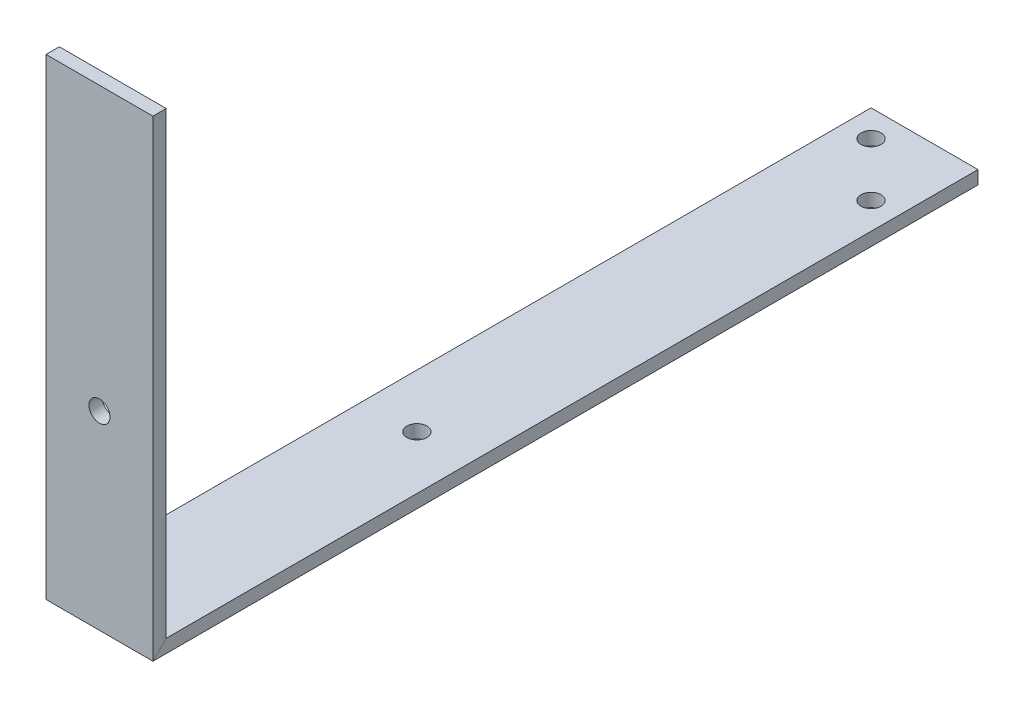
ISO-10303-21;
HEADER;
FILE_DESCRIPTION(('STEP AP214'),'2;1');
FILE_NAME('part.step','',(''),(''),'','','');
FILE_SCHEMA(('AUTOMOTIVE_DESIGN { 1 0 10303 214 1 1 1 1 }'));
ENDSEC;
DATA;
#1=APPLICATION_CONTEXT('core data for automotive mechanical design processes');
#2=APPLICATION_PROTOCOL_DEFINITION('international standard','automotive_design',2000,#1);
#3=PRODUCT_CONTEXT('',#1,'mechanical');
#4=PRODUCT('Part','Part','',(#3));
#5=PRODUCT_RELATED_PRODUCT_CATEGORY('part','',(#4));
#6=PRODUCT_DEFINITION_FORMATION('','',#4);
#7=PRODUCT_DEFINITION_CONTEXT('part definition',#1,'design');
#8=PRODUCT_DEFINITION('design','',#6,#7);
#9=PRODUCT_DEFINITION_SHAPE('','',#8);
#10=(LENGTH_UNIT() NAMED_UNIT(*) SI_UNIT(.MILLI.,.METRE.));
#11=(NAMED_UNIT(*) PLANE_ANGLE_UNIT() SI_UNIT($,.RADIAN.));
#12=(NAMED_UNIT(*) SI_UNIT($,.STERADIAN.) SOLID_ANGLE_UNIT());
#13=UNCERTAINTY_MEASURE_WITH_UNIT(LENGTH_MEASURE(1.E-05),#10,'distance_accuracy_value','');
#14=(GEOMETRIC_REPRESENTATION_CONTEXT(3) GLOBAL_UNCERTAINTY_ASSIGNED_CONTEXT((#13)) GLOBAL_UNIT_ASSIGNED_CONTEXT((#10,
#11,#12)) REPRESENTATION_CONTEXT('',''));
#15=CARTESIAN_POINT('',(0.,0.,0.));
#16=DIRECTION('',(0.,0.,1.));
#17=DIRECTION('',(1.,0.,0.));
#18=AXIS2_PLACEMENT_3D('',#15,#16,#17);
#19=CARTESIAN_POINT('',(1761.3,-570.8105,696.315));
#20=DIRECTION('',(0.,0.,-1.));
#21=DIRECTION('',(-1.,0.,0.));
#22=AXIS2_PLACEMENT_3D('',#19,#20,#21);
#23=PLANE('',#22);
#24=CARTESIAN_POINT('',(1786.7,-480.185,696.315));
#25=DIRECTION('',(0.,0.,-1.));
#26=DIRECTION('',(-1.,0.,0.));
#27=AXIS2_PLACEMENT_3D('',#24,#25,#26);
#28=CIRCLE('',#27,4.99999999999982);
#29=CARTESIAN_POINT('',(1781.7,-480.185,696.315));
#30=VERTEX_POINT('',#29);
#31=EDGE_CURVE('E130',#30,#30,#28,.T.);
#32=ORIENTED_EDGE('',*,*,#31,.T.);
#33=EDGE_LOOP('',(#32));
#34=FACE_BOUND('',#33,.T.);
#35=DIRECTION('',(0.,1.,0.));
#36=VECTOR('',#35,1.);
#37=CARTESIAN_POINT('',(1812.1,-570.8105,696.315));
#38=LINE('',#37,#36);
#39=CARTESIAN_POINT('',(1812.1,-570.395,696.315));
#40=VERTEX_POINT('',#39);
#41=CARTESIAN_POINT('',(1812.1,-346.185,696.315));
#42=VERTEX_POINT('',#41);
#43=EDGE_CURVE('E92',#40,#42,#38,.T.);
#44=ORIENTED_EDGE('',*,*,#43,.T.);
#45=DIRECTION('',(1.,0.,0.));
#46=VECTOR('',#45,1.);
#47=CARTESIAN_POINT('',(1812.1,-346.185,696.315));
#48=LINE('',#47,#46);
#49=CARTESIAN_POINT('',(1761.3,-346.185,696.315));
#50=VERTEX_POINT('',#49);
#51=EDGE_CURVE('E96',#50,#42,#48,.T.);
#52=ORIENTED_EDGE('',*,*,#51,.F.);
#53=DIRECTION('',(0.,1.,0.));
#54=VECTOR('',#53,1.);
#55=CARTESIAN_POINT('',(1761.3,-570.8105,696.315));
#56=LINE('',#55,#54);
#57=CARTESIAN_POINT('',(1761.3,-570.395,696.315));
#58=VERTEX_POINT('',#57);
#59=EDGE_CURVE('E151',#58,#50,#56,.T.);
#60=ORIENTED_EDGE('',*,*,#59,.F.);
#61=DIRECTION('',(1.,0.,0.));
#62=VECTOR('',#61,1.);
#63=CARTESIAN_POINT('',(1761.3,-570.395,696.315));
#64=LINE('',#63,#62);
#65=EDGE_CURVE('E98',#58,#40,#64,.T.);
#66=ORIENTED_EDGE('',*,*,#65,.T.);
#67=EDGE_LOOP('',(#44,#52,#60,#66));
#68=FACE_BOUND('',#67,.T.);
#69=ADVANCED_FACE('F35',(#34,#68),#23,.F.);
#70=CARTESIAN_POINT('',(1812.1,-570.8105,696.315));
#71=DIRECTION('',(-1.,0.,0.));
#72=DIRECTION('',(0.,0.,1.));
#73=AXIS2_PLACEMENT_3D('',#70,#71,#72);
#74=PLANE('',#73);
#75=DIRECTION('',(0.,1.,0.));
#76=VECTOR('',#75,1.);
#77=CARTESIAN_POINT('',(1812.1,-570.8105,690.005));
#78=LINE('',#77,#76);
#79=CARTESIAN_POINT('',(1812.1,-564.085,690.005));
#80=VERTEX_POINT('',#79);
#81=CARTESIAN_POINT('',(1812.1,-346.185,690.005));
#82=VERTEX_POINT('',#81);
#83=EDGE_CURVE('E101',#80,#82,#78,.T.);
#84=ORIENTED_EDGE('',*,*,#83,.T.);
#85=DIRECTION('',(0.,0.,-1.));
#86=VECTOR('',#85,1.);
#87=CARTESIAN_POINT('',(1812.1,-346.185,690.005));
#88=LINE('',#87,#86);
#89=EDGE_CURVE('E104',#42,#82,#88,.T.);
#90=ORIENTED_EDGE('',*,*,#89,.F.);
#91=ORIENTED_EDGE('',*,*,#43,.F.);
#92=DIRECTION('',(0.,0.707106781186548,-0.707106781186548));
#93=VECTOR('',#92,1.);
#94=CARTESIAN_POINT('',(1812.1,-376.3175,502.2375));
#95=LINE('',#94,#93);
#96=EDGE_CURVE('E43',#40,#80,#95,.T.);
#97=ORIENTED_EDGE('',*,*,#96,.T.);
#98=EDGE_LOOP('',(#84,#90,#91,#97));
#99=FACE_BOUND('',#98,.T.);
#100=ADVANCED_FACE('F105',(#99),#74,.F.);
#101=CARTESIAN_POINT('',(1761.3,-570.8105,690.005));
#102=DIRECTION('',(0.,0.,1.));
#103=DIRECTION('',(1.,0.,0.));
#104=AXIS2_PLACEMENT_3D('',#101,#102,#103);
#105=PLANE('',#104);
#106=CARTESIAN_POINT('',(1786.7,-480.185,690.005));
#107=DIRECTION('',(0.,0.,-1.));
#108=DIRECTION('',(-1.,0.,0.));
#109=AXIS2_PLACEMENT_3D('',#106,#107,#108);
#110=CIRCLE('',#109,4.99999999999982);
#111=CARTESIAN_POINT('',(1781.7,-480.185,690.005));
#112=VERTEX_POINT('',#111);
#113=EDGE_CURVE('E127',#112,#112,#110,.T.);
#114=ORIENTED_EDGE('',*,*,#113,.F.);
#115=EDGE_LOOP('',(#114));
#116=FACE_BOUND('',#115,.T.);
#117=DIRECTION('',(0.,1.,0.));
#118=VECTOR('',#117,1.);
#119=CARTESIAN_POINT('',(1761.3,-570.8105,690.005));
#120=LINE('',#119,#118);
#121=CARTESIAN_POINT('',(1761.3,-564.085,690.005));
#122=VERTEX_POINT('',#121);
#123=CARTESIAN_POINT('',(1761.3,-346.185,690.005));
#124=VERTEX_POINT('',#123);
#125=EDGE_CURVE('E160',#122,#124,#120,.T.);
#126=ORIENTED_EDGE('',*,*,#125,.T.);
#127=DIRECTION('',(-1.,0.,0.));
#128=VECTOR('',#127,1.);
#129=CARTESIAN_POINT('',(1761.3,-346.185,690.005));
#130=LINE('',#129,#128);
#131=EDGE_CURVE('E110',#82,#124,#130,.T.);
#132=ORIENTED_EDGE('',*,*,#131,.F.);
#133=ORIENTED_EDGE('',*,*,#83,.F.);
#134=DIRECTION('',(-1.,0.,0.));
#135=VECTOR('',#134,1.);
#136=CARTESIAN_POINT('',(1761.3,-564.085,690.005));
#137=LINE('',#136,#135);
#138=EDGE_CURVE('E11',#80,#122,#137,.T.);
#139=ORIENTED_EDGE('',*,*,#138,.T.);
#140=EDGE_LOOP('',(#126,#132,#133,#139));
#141=FACE_BOUND('',#140,.T.);
#142=ADVANCED_FACE('F188',(#116,#141),#105,.F.);
#143=CARTESIAN_POINT('',(1761.3,-570.8105,696.315));
#144=DIRECTION('',(1.,0.,0.));
#145=DIRECTION('',(0.,0.,-1.));
#146=AXIS2_PLACEMENT_3D('',#143,#144,#145);
#147=PLANE('',#146);
#148=ORIENTED_EDGE('',*,*,#59,.T.);
#149=DIRECTION('',(0.,0.,1.));
#150=VECTOR('',#149,1.);
#151=CARTESIAN_POINT('',(1761.3,-346.185,696.315));
#152=LINE('',#151,#150);
#153=EDGE_CURVE('E115',#124,#50,#152,.T.);
#154=ORIENTED_EDGE('',*,*,#153,.F.);
#155=ORIENTED_EDGE('',*,*,#125,.F.);
#156=DIRECTION('',(0.,-0.707106781186548,0.707106781186548));
#157=VECTOR('',#156,1.);
#158=CARTESIAN_POINT('',(1761.3,-376.3175,502.2375));
#159=LINE('',#158,#157);
#160=EDGE_CURVE('E148',#122,#58,#159,.T.);
#161=ORIENTED_EDGE('',*,*,#160,.T.);
#162=EDGE_LOOP('',(#148,#154,#155,#161));
#163=FACE_BOUND('',#162,.T.);
#164=ADVANCED_FACE('F194',(#163),#147,.F.);
#165=CARTESIAN_POINT('',(1761.3,-570.395,308.16));
#166=DIRECTION('',(0.,1.,0.));
#167=DIRECTION('',(0.,0.,1.));
#168=AXIS2_PLACEMENT_3D('',#165,#166,#167);
#169=PLANE('',#168);
#170=CARTESIAN_POINT('',(1773.99999999906,-570.395,317.152204665887));
#171=DIRECTION('',(0.,-1.,0.));
#172=DIRECTION('',(0.,0.,-1.));
#173=AXIS2_PLACEMENT_3D('',#170,#171,#172);
#174=CIRCLE('',#173,4.7624999999999);
#175=CARTESIAN_POINT('',(1773.99999999906,-570.395,312.389704665887));
#176=VERTEX_POINT('',#175);
#177=EDGE_CURVE('E120',#176,#176,#174,.T.);
#178=ORIENTED_EDGE('',*,*,#177,.F.);
#179=EDGE_LOOP('',(#178));
#180=FACE_BOUND('',#179,.T.);
#181=CARTESIAN_POINT('',(1799.39999999906,-570.395,342.552204665886));
#182=DIRECTION('',(0.,-1.,0.));
#183=DIRECTION('',(0.,0.,-1.));
#184=AXIS2_PLACEMENT_3D('',#181,#182,#183);
#185=CIRCLE('',#184,4.76250000000011);
#186=CARTESIAN_POINT('',(1799.39999999906,-570.395,337.789704665886));
#187=VERTEX_POINT('',#186);
#188=EDGE_CURVE('E123',#187,#187,#185,.T.);
#189=ORIENTED_EDGE('',*,*,#188,.F.);
#190=EDGE_LOOP('',(#189));
#191=FACE_BOUND('',#190,.T.);
#192=CARTESIAN_POINT('',(1786.69999999999,-570.395,545.545000000005));
#193=DIRECTION('',(0.,1.,0.));
#194=DIRECTION('',(0.,0.,1.));
#195=AXIS2_PLACEMENT_3D('',#192,#193,#194);
#196=CIRCLE('',#195,4.76249999999989);
#197=CARTESIAN_POINT('',(1786.69999999999,-570.395,550.307500000005));
#198=VERTEX_POINT('',#197);
#199=EDGE_CURVE('E136',#198,#198,#196,.T.);
#200=ORIENTED_EDGE('',*,*,#199,.T.);
#201=EDGE_LOOP('',(#200));
#202=FACE_BOUND('',#201,.T.);
#203=DIRECTION('',(0.,0.,1.));
#204=VECTOR('',#203,1.);
#205=CARTESIAN_POINT('',(1761.3,-570.395,308.16));
#206=LINE('',#205,#204);
#207=CARTESIAN_POINT('',(1761.3,-570.395,304.45));
#208=VERTEX_POINT('',#207);
#209=EDGE_CURVE('E155',#208,#58,#206,.T.);
#210=ORIENTED_EDGE('',*,*,#209,.F.);
#211=DIRECTION('',(1.,0.,0.));
#212=VECTOR('',#211,1.);
#213=CARTESIAN_POINT('',(1761.3,-570.395,304.45));
#214=LINE('',#213,#212);
#215=CARTESIAN_POINT('',(1812.1,-570.395,304.45));
#216=VERTEX_POINT('',#215);
#217=EDGE_CURVE('E51',#208,#216,#214,.T.);
#218=ORIENTED_EDGE('',*,*,#217,.T.);
#219=DIRECTION('',(0.,0.,1.));
#220=VECTOR('',#219,1.);
#221=CARTESIAN_POINT('',(1812.1,-570.395,308.16));
#222=LINE('',#221,#220);
#223=EDGE_CURVE('E149',#216,#40,#222,.T.);
#224=ORIENTED_EDGE('',*,*,#223,.T.);
#225=ORIENTED_EDGE('',*,*,#65,.F.);
#226=EDGE_LOOP('',(#210,#218,#224,#225));
#227=FACE_BOUND('',#226,.T.);
#228=ADVANCED_FACE('F200',(#180,#191,#202,#227),#169,.F.);
#229=CARTESIAN_POINT('',(1812.1,-570.395,308.16));
#230=DIRECTION('',(-1.,0.,0.));
#231=DIRECTION('',(0.,0.,1.));
#232=AXIS2_PLACEMENT_3D('',#229,#230,#231);
#233=PLANE('',#232);
#234=ORIENTED_EDGE('',*,*,#223,.F.);
#235=DIRECTION('',(0.,1.,0.));
#236=VECTOR('',#235,1.);
#237=CARTESIAN_POINT('',(1812.1,-570.435,304.45));
#238=LINE('',#237,#236);
#239=CARTESIAN_POINT('',(1812.1,-564.085,304.45));
#240=VERTEX_POINT('',#239);
#241=EDGE_CURVE('E142',#216,#240,#238,.T.);
#242=ORIENTED_EDGE('',*,*,#241,.T.);
#243=DIRECTION('',(0.,0.,1.));
#244=VECTOR('',#243,1.);
#245=CARTESIAN_POINT('',(1812.1,-564.085,308.16));
#246=LINE('',#245,#244);
#247=EDGE_CURVE('E59',#240,#80,#246,.T.);
#248=ORIENTED_EDGE('',*,*,#247,.T.);
#249=ORIENTED_EDGE('',*,*,#96,.F.);
#250=EDGE_LOOP('',(#234,#242,#248,#249));
#251=FACE_BOUND('',#250,.T.);
#252=ADVANCED_FACE('F205',(#251),#233,.F.);
#253=CARTESIAN_POINT('',(1761.3,-564.085,308.16));
#254=DIRECTION('',(0.,-1.,0.));
#255=DIRECTION('',(0.,0.,-1.));
#256=AXIS2_PLACEMENT_3D('',#253,#254,#255);
#257=PLANE('',#256);
#258=CARTESIAN_POINT('',(1773.99999999906,-564.085,317.152204665887));
#259=DIRECTION('',(0.,-1.,0.));
#260=DIRECTION('',(0.,0.,-1.));
#261=AXIS2_PLACEMENT_3D('',#258,#259,#260);
#262=CIRCLE('',#261,4.7624999999999);
#263=CARTESIAN_POINT('',(1773.99999999906,-564.085,312.389704665887));
#264=VERTEX_POINT('',#263);
#265=EDGE_CURVE('E38',#264,#264,#262,.T.);
#266=ORIENTED_EDGE('',*,*,#265,.T.);
#267=EDGE_LOOP('',(#266));
#268=FACE_BOUND('',#267,.T.);
#269=CARTESIAN_POINT('',(1799.39999999906,-564.085,342.552204665886));
#270=DIRECTION('',(0.,-1.,0.));
#271=DIRECTION('',(0.,0.,-1.));
#272=AXIS2_PLACEMENT_3D('',#269,#270,#271);
#273=CIRCLE('',#272,4.76250000000011);
#274=CARTESIAN_POINT('',(1799.39999999906,-564.085,337.789704665886));
#275=VERTEX_POINT('',#274);
#276=EDGE_CURVE('E126',#275,#275,#273,.T.);
#277=ORIENTED_EDGE('',*,*,#276,.T.);
#278=EDGE_LOOP('',(#277));
#279=FACE_BOUND('',#278,.T.);
#280=CARTESIAN_POINT('',(1786.69999999999,-564.085,545.545000000005));
#281=DIRECTION('',(0.,1.,0.));
#282=DIRECTION('',(0.,0.,1.));
#283=AXIS2_PLACEMENT_3D('',#280,#281,#282);
#284=CIRCLE('',#283,4.76249999999989);
#285=CARTESIAN_POINT('',(1786.69999999999,-564.085,550.307500000005));
#286=VERTEX_POINT('',#285);
#287=EDGE_CURVE('E133',#286,#286,#284,.T.);
#288=ORIENTED_EDGE('',*,*,#287,.F.);
#289=EDGE_LOOP('',(#288));
#290=FACE_BOUND('',#289,.T.);
#291=ORIENTED_EDGE('',*,*,#247,.F.);
#292=DIRECTION('',(1.,0.,0.));
#293=VECTOR('',#292,1.);
#294=CARTESIAN_POINT('',(1812.1,-564.085,304.45));
#295=LINE('',#294,#293);
#296=CARTESIAN_POINT('',(1761.3,-564.085,304.45));
#297=VERTEX_POINT('',#296);
#298=EDGE_CURVE('E139',#297,#240,#295,.T.);
#299=ORIENTED_EDGE('',*,*,#298,.F.);
#300=DIRECTION('',(0.,0.,1.));
#301=VECTOR('',#300,1.);
#302=CARTESIAN_POINT('',(1761.3,-564.085,308.16));
#303=LINE('',#302,#301);
#304=EDGE_CURVE('E153',#297,#122,#303,.T.);
#305=ORIENTED_EDGE('',*,*,#304,.T.);
#306=ORIENTED_EDGE('',*,*,#138,.F.);
#307=EDGE_LOOP('',(#291,#299,#305,#306));
#308=FACE_BOUND('',#307,.T.);
#309=ADVANCED_FACE('F165',(#268,#279,#290,#308),#257,.F.);
#310=CARTESIAN_POINT('',(1761.3,-570.395,308.16));
#311=DIRECTION('',(1.,0.,0.));
#312=DIRECTION('',(0.,0.,-1.));
#313=AXIS2_PLACEMENT_3D('',#310,#311,#312);
#314=PLANE('',#313);
#315=ORIENTED_EDGE('',*,*,#304,.F.);
#316=DIRECTION('',(0.,1.,0.));
#317=VECTOR('',#316,1.);
#318=CARTESIAN_POINT('',(1761.3,-570.435,304.45));
#319=LINE('',#318,#317);
#320=EDGE_CURVE('E141',#208,#297,#319,.T.);
#321=ORIENTED_EDGE('',*,*,#320,.F.);
#322=ORIENTED_EDGE('',*,*,#209,.T.);
#323=ORIENTED_EDGE('',*,*,#160,.F.);
#324=EDGE_LOOP('',(#315,#321,#322,#323));
#325=FACE_BOUND('',#324,.T.);
#326=ADVANCED_FACE('F202',(#325),#314,.F.);
#327=CARTESIAN_POINT('',(1812.1,-570.435,304.45));
#328=DIRECTION('',(0.,0.,1.));
#329=DIRECTION('',(1.,0.,0.));
#330=AXIS2_PLACEMENT_3D('',#327,#328,#329);
#331=PLANE('',#330);
#332=ORIENTED_EDGE('',*,*,#320,.T.);
#333=ORIENTED_EDGE('',*,*,#298,.T.);
#334=ORIENTED_EDGE('',*,*,#241,.F.);
#335=ORIENTED_EDGE('',*,*,#217,.F.);
#336=EDGE_LOOP('',(#332,#333,#334,#335));
#337=FACE_BOUND('',#336,.T.);
#338=ADVANCED_FACE('F207',(#337),#331,.F.);
#339=CARTESIAN_POINT('',(1786.69999999999,-597.085,545.545000000005));
#340=DIRECTION('',(0.,1.,0.));
#341=DIRECTION('',(0.,0.,1.));
#342=AXIS2_PLACEMENT_3D('',#339,#340,#341);
#343=CYLINDRICAL_SURFACE('',#342,4.76249999999989);
#344=ORIENTED_EDGE('',*,*,#287,.T.);
#345=EDGE_LOOP('',(#344));
#346=FACE_BOUND('',#345,.T.);
#347=ORIENTED_EDGE('',*,*,#199,.F.);
#348=EDGE_LOOP('',(#347));
#349=FACE_BOUND('',#348,.T.);
#350=ADVANCED_FACE('F180',(#346,#349),#343,.F.);
#351=CARTESIAN_POINT('',(1786.7,-480.185,723.005));
#352=DIRECTION('',(0.,0.,-1.));
#353=DIRECTION('',(-1.,0.,0.));
#354=AXIS2_PLACEMENT_3D('',#351,#352,#353);
#355=CYLINDRICAL_SURFACE('',#354,4.99999999999982);
#356=ORIENTED_EDGE('',*,*,#113,.T.);
#357=EDGE_LOOP('',(#356));
#358=FACE_BOUND('',#357,.T.);
#359=ORIENTED_EDGE('',*,*,#31,.F.);
#360=EDGE_LOOP('',(#359));
#361=FACE_BOUND('',#360,.T.);
#362=ADVANCED_FACE('F171',(#358,#361),#355,.F.);
#363=CARTESIAN_POINT('',(1799.39999999906,-520.395,342.552204665886));
#364=DIRECTION('',(0.,-1.,0.));
#365=DIRECTION('',(0.,0.,-1.));
#366=AXIS2_PLACEMENT_3D('',#363,#364,#365);
#367=CYLINDRICAL_SURFACE('',#366,4.76250000000011);
#368=ORIENTED_EDGE('',*,*,#188,.T.);
#369=EDGE_LOOP('',(#368));
#370=FACE_BOUND('',#369,.T.);
#371=ORIENTED_EDGE('',*,*,#276,.F.);
#372=EDGE_LOOP('',(#371));
#373=FACE_BOUND('',#372,.T.);
#374=ADVANCED_FACE('F168',(#370,#373),#367,.F.);
#375=CARTESIAN_POINT('',(1773.99999999906,-520.395,317.152204665887));
#376=DIRECTION('',(0.,-1.,0.));
#377=DIRECTION('',(0.,0.,-1.));
#378=AXIS2_PLACEMENT_3D('',#375,#376,#377);
#379=CYLINDRICAL_SURFACE('',#378,4.7624999999999);
#380=ORIENTED_EDGE('',*,*,#177,.T.);
#381=EDGE_LOOP('',(#380));
#382=FACE_BOUND('',#381,.T.);
#383=ORIENTED_EDGE('',*,*,#265,.F.);
#384=EDGE_LOOP('',(#383));
#385=FACE_BOUND('',#384,.T.);
#386=ADVANCED_FACE('F170',(#382,#385),#379,.F.);
#387=CARTESIAN_POINT('',(0.,-346.185,0.));
#388=DIRECTION('',(0.,-1.,0.));
#389=DIRECTION('',(0.,0.,-1.));
#390=AXIS2_PLACEMENT_3D('',#387,#388,#389);
#391=PLANE('',#390);
#392=ORIENTED_EDGE('',*,*,#51,.T.);
#393=ORIENTED_EDGE('',*,*,#89,.T.);
#394=ORIENTED_EDGE('',*,*,#131,.T.);
#395=ORIENTED_EDGE('',*,*,#153,.T.);
#396=EDGE_LOOP('',(#392,#393,#394,#395));
#397=FACE_BOUND('',#396,.T.);
#398=ADVANCED_FACE('F113',(#397),#391,.F.);
#399=CLOSED_SHELL('',(#69,#100,#142,#164,#228,#252,#309,#326,#338,#350,#362,#374,#386,#398));
#400=MANIFOLD_SOLID_BREP('B2',#399);
#401=ADVANCED_BREP_SHAPE_REPRESENTATION('',(#18,#400),#14);
#402=SHAPE_DEFINITION_REPRESENTATION(#9,#401);
ENDSEC;
END-ISO-10303-21;
